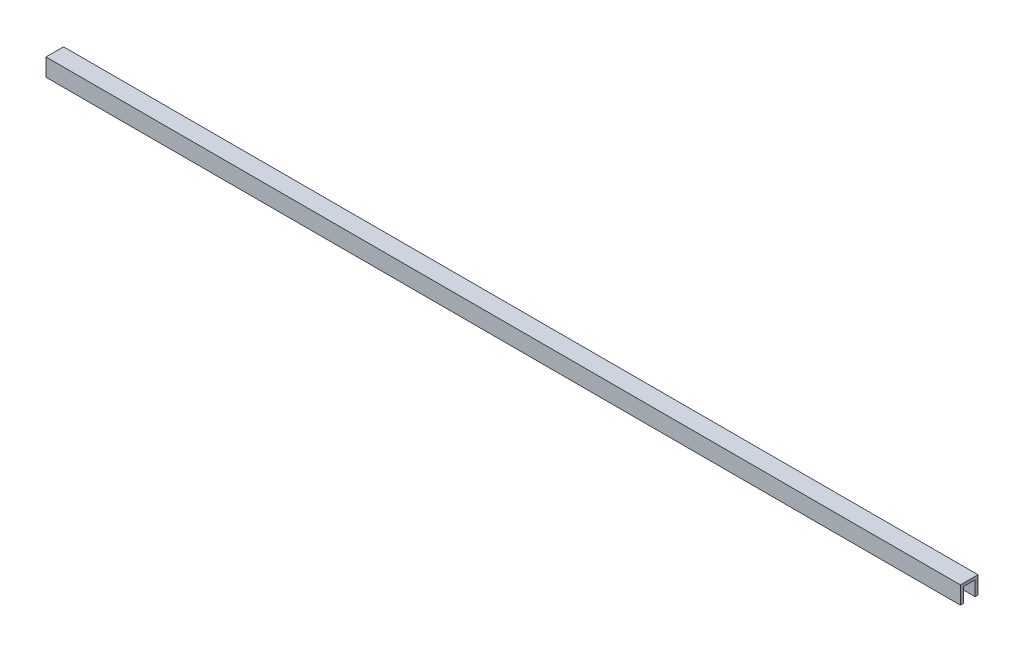
ISO-10303-21;
HEADER;
FILE_DESCRIPTION(('STEP AP214'),'2;1');
FILE_NAME('part.step','',(''),(''),'','','');
FILE_SCHEMA(('AUTOMOTIVE_DESIGN { 1 0 10303 214 1 1 1 1 }'));
ENDSEC;
DATA;
#1=APPLICATION_CONTEXT('core data for automotive mechanical design processes');
#2=APPLICATION_PROTOCOL_DEFINITION('international standard','automotive_design',2000,#1);
#3=PRODUCT_CONTEXT('',#1,'mechanical');
#4=PRODUCT('Part','Part','',(#3));
#5=PRODUCT_RELATED_PRODUCT_CATEGORY('part','',(#4));
#6=PRODUCT_DEFINITION_FORMATION('','',#4);
#7=PRODUCT_DEFINITION_CONTEXT('part definition',#1,'design');
#8=PRODUCT_DEFINITION('design','',#6,#7);
#9=PRODUCT_DEFINITION_SHAPE('','',#8);
#10=(LENGTH_UNIT() NAMED_UNIT(*) SI_UNIT(.MILLI.,.METRE.));
#11=(NAMED_UNIT(*) PLANE_ANGLE_UNIT() SI_UNIT($,.RADIAN.));
#12=(NAMED_UNIT(*) SI_UNIT($,.STERADIAN.) SOLID_ANGLE_UNIT());
#13=UNCERTAINTY_MEASURE_WITH_UNIT(LENGTH_MEASURE(1.E-05),#10,'distance_accuracy_value','');
#14=(GEOMETRIC_REPRESENTATION_CONTEXT(3) GLOBAL_UNCERTAINTY_ASSIGNED_CONTEXT((#13)) GLOBAL_UNIT_ASSIGNED_CONTEXT((#10,
#11,#12)) REPRESENTATION_CONTEXT('',''));
#15=CARTESIAN_POINT('',(0.,0.,0.));
#16=DIRECTION('',(0.,0.,1.));
#17=DIRECTION('',(1.,0.,0.));
#18=AXIS2_PLACEMENT_3D('',#15,#16,#17);
#19=CARTESIAN_POINT('',(990.6,-19.05,0.));
#20=DIRECTION('',(0.,1.,0.));
#21=DIRECTION('',(0.,0.,1.));
#22=AXIS2_PLACEMENT_3D('',#19,#20,#21);
#23=PLANE('',#22);
#24=DIRECTION('',(0.,0.,-1.));
#25=VECTOR('',#24,1.);
#26=CARTESIAN_POINT('',(0.,-19.05,0.));
#27=LINE('',#26,#25);
#28=CARTESIAN_POINT('',(0.,-19.05,0.));
#29=VERTEX_POINT('',#28);
#30=CARTESIAN_POINT('',(0.,-19.05,-3.175));
#31=VERTEX_POINT('',#30);
#32=EDGE_CURVE('E128',#29,#31,#27,.T.);
#33=ORIENTED_EDGE('',*,*,#32,.T.);
#34=DIRECTION('',(-1.,0.,0.));
#35=VECTOR('',#34,1.);
#36=CARTESIAN_POINT('',(990.6,-19.05,-3.175));
#37=LINE('',#36,#35);
#38=CARTESIAN_POINT('',(990.6,-19.05,-3.175));
#39=VERTEX_POINT('',#38);
#40=EDGE_CURVE('E11',#39,#31,#37,.T.);
#41=ORIENTED_EDGE('',*,*,#40,.F.);
#42=DIRECTION('',(0.,0.,-1.));
#43=VECTOR('',#42,1.);
#44=CARTESIAN_POINT('',(990.6,-19.05,0.));
#45=LINE('',#44,#43);
#46=CARTESIAN_POINT('',(990.6,-19.05,0.));
#47=VERTEX_POINT('',#46);
#48=EDGE_CURVE('E142',#47,#39,#45,.T.);
#49=ORIENTED_EDGE('',*,*,#48,.F.);
#50=DIRECTION('',(-1.,0.,0.));
#51=VECTOR('',#50,1.);
#52=CARTESIAN_POINT('',(990.6,-19.05,0.));
#53=LINE('',#52,#51);
#54=EDGE_CURVE('E124',#47,#29,#53,.T.);
#55=ORIENTED_EDGE('',*,*,#54,.T.);
#56=EDGE_LOOP('',(#33,#41,#49,#55));
#57=FACE_BOUND('',#56,.T.);
#58=ADVANCED_FACE('F32',(#57),#23,.F.);
#59=CARTESIAN_POINT('',(990.6,-19.05,-3.175));
#60=DIRECTION('',(0.,0.,1.));
#61=DIRECTION('',(1.,0.,0.));
#62=AXIS2_PLACEMENT_3D('',#59,#60,#61);
#63=PLANE('',#62);
#64=DIRECTION('',(0.,1.,0.));
#65=VECTOR('',#64,1.);
#66=CARTESIAN_POINT('',(0.,-19.05,-3.175));
#67=LINE('',#66,#65);
#68=CARTESIAN_POINT('',(0.,-3.175,-3.175));
#69=VERTEX_POINT('',#68);
#70=EDGE_CURVE('E131',#31,#69,#67,.T.);
#71=ORIENTED_EDGE('',*,*,#70,.T.);
#72=DIRECTION('',(-1.,0.,0.));
#73=VECTOR('',#72,1.);
#74=CARTESIAN_POINT('',(990.6,-3.175,-3.175));
#75=LINE('',#74,#73);
#76=CARTESIAN_POINT('',(990.6,-3.175,-3.175));
#77=VERTEX_POINT('',#76);
#78=EDGE_CURVE('E40',#77,#69,#75,.T.);
#79=ORIENTED_EDGE('',*,*,#78,.F.);
#80=DIRECTION('',(0.,1.,0.));
#81=VECTOR('',#80,1.);
#82=CARTESIAN_POINT('',(990.6,-19.05,-3.175));
#83=LINE('',#82,#81);
#84=EDGE_CURVE('E91',#39,#77,#83,.T.);
#85=ORIENTED_EDGE('',*,*,#84,.F.);
#86=ORIENTED_EDGE('',*,*,#40,.T.);
#87=EDGE_LOOP('',(#71,#79,#85,#86));
#88=FACE_BOUND('',#87,.T.);
#89=ADVANCED_FACE('F177',(#88),#63,.F.);
#90=CARTESIAN_POINT('',(990.6,-3.175,-3.175));
#91=DIRECTION('',(0.,1.,0.));
#92=DIRECTION('',(0.,0.,1.));
#93=AXIS2_PLACEMENT_3D('',#90,#91,#92);
#94=PLANE('',#93);
#95=DIRECTION('',(0.,0.,-1.));
#96=VECTOR('',#95,1.);
#97=CARTESIAN_POINT('',(0.,-3.175,-3.175));
#98=LINE('',#97,#96);
#99=CARTESIAN_POINT('',(0.,-3.175,-15.875));
#100=VERTEX_POINT('',#99);
#101=EDGE_CURVE('E133',#69,#100,#98,.T.);
#102=ORIENTED_EDGE('',*,*,#101,.T.);
#103=DIRECTION('',(-1.,0.,0.));
#104=VECTOR('',#103,1.);
#105=CARTESIAN_POINT('',(990.6,-3.175,-15.875));
#106=LINE('',#105,#104);
#107=CARTESIAN_POINT('',(990.6,-3.175,-15.875));
#108=VERTEX_POINT('',#107);
#109=EDGE_CURVE('E149',#108,#100,#106,.T.);
#110=ORIENTED_EDGE('',*,*,#109,.F.);
#111=DIRECTION('',(0.,0.,-1.));
#112=VECTOR('',#111,1.);
#113=CARTESIAN_POINT('',(990.6,-3.175,-3.175));
#114=LINE('',#113,#112);
#115=EDGE_CURVE('E157',#77,#108,#114,.T.);
#116=ORIENTED_EDGE('',*,*,#115,.F.);
#117=ORIENTED_EDGE('',*,*,#78,.T.);
#118=EDGE_LOOP('',(#102,#110,#116,#117));
#119=FACE_BOUND('',#118,.T.);
#120=ADVANCED_FACE('F155',(#119),#94,.F.);
#121=CARTESIAN_POINT('',(990.6,-3.175,-15.875));
#122=DIRECTION('',(0.,0.,-1.));
#123=DIRECTION('',(-1.,0.,0.));
#124=AXIS2_PLACEMENT_3D('',#121,#122,#123);
#125=PLANE('',#124);
#126=DIRECTION('',(0.,-1.,0.));
#127=VECTOR('',#126,1.);
#128=CARTESIAN_POINT('',(0.,-3.175,-15.875));
#129=LINE('',#128,#127);
#130=CARTESIAN_POINT('',(0.,-19.05,-15.875));
#131=VERTEX_POINT('',#130);
#132=EDGE_CURVE('E135',#100,#131,#129,.T.);
#133=ORIENTED_EDGE('',*,*,#132,.T.);
#134=DIRECTION('',(-1.,0.,0.));
#135=VECTOR('',#134,1.);
#136=CARTESIAN_POINT('',(990.6,-19.05,-15.875));
#137=LINE('',#136,#135);
#138=CARTESIAN_POINT('',(990.6,-19.05,-15.875));
#139=VERTEX_POINT('',#138);
#140=EDGE_CURVE('E146',#139,#131,#137,.T.);
#141=ORIENTED_EDGE('',*,*,#140,.F.);
#142=DIRECTION('',(0.,-1.,0.));
#143=VECTOR('',#142,1.);
#144=CARTESIAN_POINT('',(990.6,-3.175,-15.875));
#145=LINE('',#144,#143);
#146=EDGE_CURVE('E169',#108,#139,#145,.T.);
#147=ORIENTED_EDGE('',*,*,#146,.F.);
#148=ORIENTED_EDGE('',*,*,#109,.T.);
#149=EDGE_LOOP('',(#133,#141,#147,#148));
#150=FACE_BOUND('',#149,.T.);
#151=ADVANCED_FACE('F165',(#150),#125,.F.);
#152=CARTESIAN_POINT('',(990.6,-19.05,-19.05));
#153=DIRECTION('',(0.,1.,0.));
#154=DIRECTION('',(0.,0.,1.));
#155=AXIS2_PLACEMENT_3D('',#152,#153,#154);
#156=PLANE('',#155);
#157=DIRECTION('',(0.,0.,-1.));
#158=VECTOR('',#157,1.);
#159=CARTESIAN_POINT('',(0.,-19.05,-19.05));
#160=LINE('',#159,#158);
#161=CARTESIAN_POINT('',(0.,-19.05,-19.05));
#162=VERTEX_POINT('',#161);
#163=EDGE_CURVE('E137',#131,#162,#160,.T.);
#164=ORIENTED_EDGE('',*,*,#163,.T.);
#165=DIRECTION('',(-1.,0.,0.));
#166=VECTOR('',#165,1.);
#167=CARTESIAN_POINT('',(990.6,-19.05,-19.05));
#168=LINE('',#167,#166);
#169=CARTESIAN_POINT('',(990.6,-19.05,-19.05));
#170=VERTEX_POINT('',#169);
#171=EDGE_CURVE('E119',#170,#162,#168,.T.);
#172=ORIENTED_EDGE('',*,*,#171,.F.);
#173=DIRECTION('',(0.,0.,-1.));
#174=VECTOR('',#173,1.);
#175=CARTESIAN_POINT('',(990.6,-19.05,-19.05));
#176=LINE('',#175,#174);
#177=EDGE_CURVE('E110',#139,#170,#176,.T.);
#178=ORIENTED_EDGE('',*,*,#177,.F.);
#179=ORIENTED_EDGE('',*,*,#140,.T.);
#180=EDGE_LOOP('',(#164,#172,#178,#179));
#181=FACE_BOUND('',#180,.T.);
#182=ADVANCED_FACE('F168',(#181),#156,.F.);
#183=CARTESIAN_POINT('',(990.6,0.,-19.05));
#184=DIRECTION('',(0.,0.,1.));
#185=DIRECTION('',(0.,-1.,0.));
#186=AXIS2_PLACEMENT_3D('',#183,#184,#185);
#187=PLANE('',#186);
#188=DIRECTION('',(0.,1.,0.));
#189=VECTOR('',#188,1.);
#190=CARTESIAN_POINT('',(0.,0.,-19.05));
#191=LINE('',#190,#189);
#192=CARTESIAN_POINT('',(0.,0.,-19.05));
#193=VERTEX_POINT('',#192);
#194=EDGE_CURVE('E118',#162,#193,#191,.T.);
#195=ORIENTED_EDGE('',*,*,#194,.T.);
#196=DIRECTION('',(-1.,0.,0.));
#197=VECTOR('',#196,1.);
#198=CARTESIAN_POINT('',(990.6,0.,-19.05));
#199=LINE('',#198,#197);
#200=CARTESIAN_POINT('',(990.6,0.,-19.05));
#201=VERTEX_POINT('',#200);
#202=EDGE_CURVE('E115',#201,#193,#199,.T.);
#203=ORIENTED_EDGE('',*,*,#202,.F.);
#204=DIRECTION('',(0.,1.,0.));
#205=VECTOR('',#204,1.);
#206=CARTESIAN_POINT('',(990.6,0.,-19.05));
#207=LINE('',#206,#205);
#208=EDGE_CURVE('E104',#170,#201,#207,.T.);
#209=ORIENTED_EDGE('',*,*,#208,.F.);
#210=ORIENTED_EDGE('',*,*,#171,.T.);
#211=EDGE_LOOP('',(#195,#203,#209,#210));
#212=FACE_BOUND('',#211,.T.);
#213=ADVANCED_FACE('F116',(#212),#187,.F.);
#214=CARTESIAN_POINT('',(990.6,0.,0.));
#215=DIRECTION('',(0.,-1.,0.));
#216=DIRECTION('',(0.,0.,-1.));
#217=AXIS2_PLACEMENT_3D('',#214,#215,#216);
#218=PLANE('',#217);
#219=DIRECTION('',(0.,0.,1.));
#220=VECTOR('',#219,1.);
#221=CARTESIAN_POINT('',(0.,0.,0.));
#222=LINE('',#221,#220);
#223=CARTESIAN_POINT('',(0.,0.,0.));
#224=VERTEX_POINT('',#223);
#225=EDGE_CURVE('E77',#193,#224,#222,.T.);
#226=ORIENTED_EDGE('',*,*,#225,.T.);
#227=DIRECTION('',(-1.,0.,0.));
#228=VECTOR('',#227,1.);
#229=CARTESIAN_POINT('',(990.6,0.,0.));
#230=LINE('',#229,#228);
#231=CARTESIAN_POINT('',(990.6,0.,0.));
#232=VERTEX_POINT('',#231);
#233=EDGE_CURVE('E120',#232,#224,#230,.T.);
#234=ORIENTED_EDGE('',*,*,#233,.F.);
#235=DIRECTION('',(0.,0.,1.));
#236=VECTOR('',#235,1.);
#237=CARTESIAN_POINT('',(990.6,0.,0.));
#238=LINE('',#237,#236);
#239=EDGE_CURVE('E108',#201,#232,#238,.T.);
#240=ORIENTED_EDGE('',*,*,#239,.F.);
#241=ORIENTED_EDGE('',*,*,#202,.T.);
#242=EDGE_LOOP('',(#226,#234,#240,#241));
#243=FACE_BOUND('',#242,.T.);
#244=ADVANCED_FACE('F122',(#243),#218,.F.);
#245=CARTESIAN_POINT('',(990.6,-19.05,0.));
#246=DIRECTION('',(0.,0.,-1.));
#247=DIRECTION('',(-1.,0.,0.));
#248=AXIS2_PLACEMENT_3D('',#245,#246,#247);
#249=PLANE('',#248);
#250=DIRECTION('',(0.,-1.,0.));
#251=VECTOR('',#250,1.);
#252=CARTESIAN_POINT('',(0.,-19.05,0.));
#253=LINE('',#252,#251);
#254=EDGE_CURVE('E83',#224,#29,#253,.T.);
#255=ORIENTED_EDGE('',*,*,#254,.T.);
#256=ORIENTED_EDGE('',*,*,#54,.F.);
#257=DIRECTION('',(0.,-1.,0.));
#258=VECTOR('',#257,1.);
#259=CARTESIAN_POINT('',(990.6,-19.05,0.));
#260=LINE('',#259,#258);
#261=EDGE_CURVE('E48',#232,#47,#260,.T.);
#262=ORIENTED_EDGE('',*,*,#261,.F.);
#263=ORIENTED_EDGE('',*,*,#233,.T.);
#264=EDGE_LOOP('',(#255,#256,#262,#263));
#265=FACE_BOUND('',#264,.T.);
#266=ADVANCED_FACE('F193',(#265),#249,.F.);
#267=CARTESIAN_POINT('',(990.6,0.,0.));
#268=DIRECTION('',(1.,0.,0.));
#269=DIRECTION('',(0.,0.,-1.));
#270=AXIS2_PLACEMENT_3D('',#267,#268,#269);
#271=PLANE('',#270);
#272=ORIENTED_EDGE('',*,*,#48,.T.);
#273=ORIENTED_EDGE('',*,*,#84,.T.);
#274=ORIENTED_EDGE('',*,*,#115,.T.);
#275=ORIENTED_EDGE('',*,*,#146,.T.);
#276=ORIENTED_EDGE('',*,*,#177,.T.);
#277=ORIENTED_EDGE('',*,*,#208,.T.);
#278=ORIENTED_EDGE('',*,*,#239,.T.);
#279=ORIENTED_EDGE('',*,*,#261,.T.);
#280=EDGE_LOOP('',(#272,#273,#274,#275,#276,#277,#278,#279));
#281=FACE_BOUND('',#280,.T.);
#282=ADVANCED_FACE('F106',(#281),#271,.T.);
#283=CARTESIAN_POINT('',(0.,0.,0.));
#284=DIRECTION('',(1.,0.,0.));
#285=DIRECTION('',(0.,0.,-1.));
#286=AXIS2_PLACEMENT_3D('',#283,#284,#285);
#287=PLANE('',#286);
#288=ORIENTED_EDGE('',*,*,#32,.F.);
#289=ORIENTED_EDGE('',*,*,#254,.F.);
#290=ORIENTED_EDGE('',*,*,#225,.F.);
#291=ORIENTED_EDGE('',*,*,#194,.F.);
#292=ORIENTED_EDGE('',*,*,#163,.F.);
#293=ORIENTED_EDGE('',*,*,#132,.F.);
#294=ORIENTED_EDGE('',*,*,#101,.F.);
#295=ORIENTED_EDGE('',*,*,#70,.F.);
#296=EDGE_LOOP('',(#288,#289,#290,#291,#292,#293,#294,#295));
#297=FACE_BOUND('',#296,.T.);
#298=ADVANCED_FACE('F161',(#297),#287,.F.);
#299=CLOSED_SHELL('',(#58,#89,#120,#151,#182,#213,#244,#266,#282,#298));
#300=MANIFOLD_SOLID_BREP('B2',#299);
#301=ADVANCED_BREP_SHAPE_REPRESENTATION('',(#18,#300),#14);
#302=SHAPE_DEFINITION_REPRESENTATION(#9,#301);
ENDSEC;
END-ISO-10303-21;
